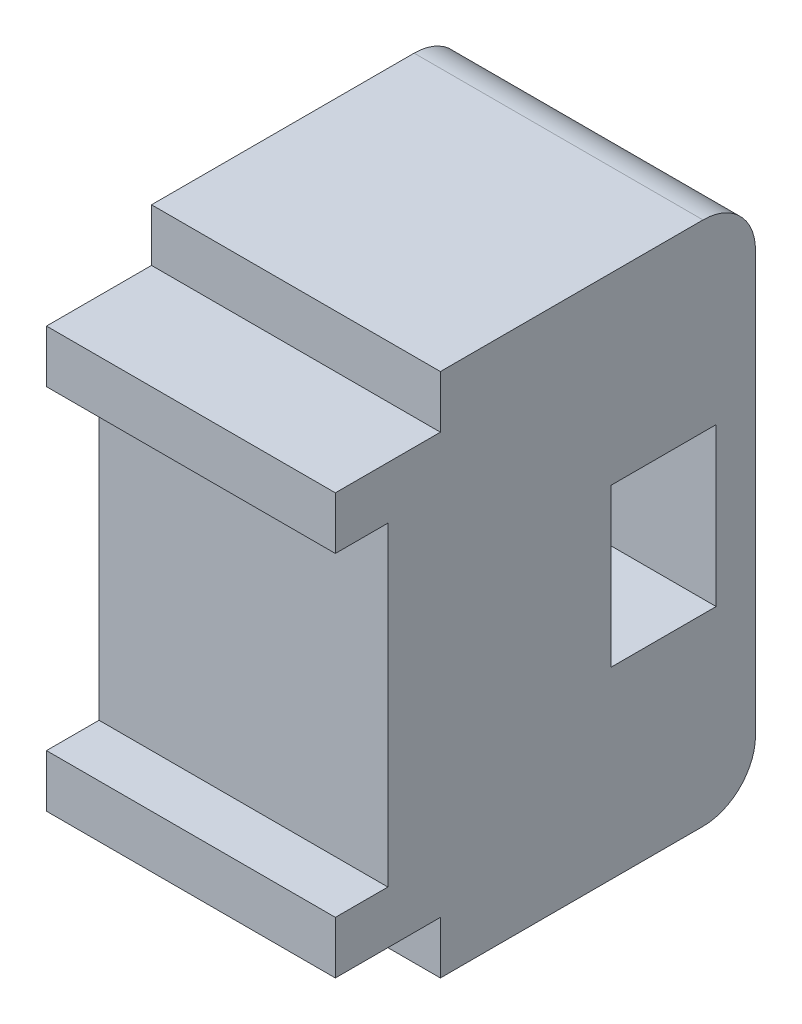
ISO-10303-21;
HEADER;
FILE_DESCRIPTION(('STEP AP214'),'2;1');
FILE_NAME('part.step','',(''),(''),'','','');
FILE_SCHEMA(('AUTOMOTIVE_DESIGN { 1 0 10303 214 1 1 1 1 }'));
ENDSEC;
DATA;
#1=APPLICATION_CONTEXT('core data for automotive mechanical design processes');
#2=APPLICATION_PROTOCOL_DEFINITION('international standard','automotive_design',2000,#1);
#3=PRODUCT_CONTEXT('',#1,'mechanical');
#4=PRODUCT('Part','Part','',(#3));
#5=PRODUCT_RELATED_PRODUCT_CATEGORY('part','',(#4));
#6=PRODUCT_DEFINITION_FORMATION('','',#4);
#7=PRODUCT_DEFINITION_CONTEXT('part definition',#1,'design');
#8=PRODUCT_DEFINITION('design','',#6,#7);
#9=PRODUCT_DEFINITION_SHAPE('','',#8);
#10=(LENGTH_UNIT() NAMED_UNIT(*) SI_UNIT(.MILLI.,.METRE.));
#11=(NAMED_UNIT(*) PLANE_ANGLE_UNIT() SI_UNIT($,.RADIAN.));
#12=(NAMED_UNIT(*) SI_UNIT($,.STERADIAN.) SOLID_ANGLE_UNIT());
#13=UNCERTAINTY_MEASURE_WITH_UNIT(LENGTH_MEASURE(1.E-05),#10,'distance_accuracy_value','');
#14=(GEOMETRIC_REPRESENTATION_CONTEXT(3) GLOBAL_UNCERTAINTY_ASSIGNED_CONTEXT((#13)) GLOBAL_UNIT_ASSIGNED_CONTEXT((#10,
#11,#12)) REPRESENTATION_CONTEXT('',''));
#15=CARTESIAN_POINT('',(0.,0.,0.));
#16=DIRECTION('',(0.,0.,1.));
#17=DIRECTION('',(1.,0.,0.));
#18=AXIS2_PLACEMENT_3D('',#15,#16,#17);
#19=CARTESIAN_POINT('',(11.,0.,0.));
#20=DIRECTION('',(1.,0.,0.));
#21=DIRECTION('',(0.,0.,-1.));
#22=AXIS2_PLACEMENT_3D('',#19,#20,#21);
#23=PLANE('',#22);
#24=DIRECTION('',(0.,1.,0.));
#25=VECTOR('',#24,1.);
#26=CARTESIAN_POINT('',(11.,-10.,-6.));
#27=LINE('',#26,#25);
#28=CARTESIAN_POINT('',(11.,-8.,-6.));
#29=VERTEX_POINT('',#28);
#30=CARTESIAN_POINT('',(11.,8.,-6.));
#31=VERTEX_POINT('',#30);
#32=EDGE_CURVE('E320',#29,#31,#27,.T.);
#33=ORIENTED_EDGE('',*,*,#32,.T.);
#34=CARTESIAN_POINT('',(11.,8.,-4.));
#35=DIRECTION('',(1.,0.,0.));
#36=DIRECTION('',(0.,0.,-1.));
#37=AXIS2_PLACEMENT_3D('',#34,#35,#36);
#38=CIRCLE('',#37,2.);
#39=CARTESIAN_POINT('',(11.,10.,-4.));
#40=VERTEX_POINT('',#39);
#41=EDGE_CURVE('E60',#31,#40,#38,.T.);
#42=ORIENTED_EDGE('',*,*,#41,.T.);
#43=DIRECTION('',(0.,0.,1.));
#44=VECTOR('',#43,1.);
#45=CARTESIAN_POINT('',(11.,10.,6.));
#46=LINE('',#45,#44);
#47=CARTESIAN_POINT('',(11.,10.,6.));
#48=VERTEX_POINT('',#47);
#49=EDGE_CURVE('E307',#40,#48,#46,.T.);
#50=ORIENTED_EDGE('',*,*,#49,.T.);
#51=DIRECTION('',(0.,-1.,0.));
#52=VECTOR('',#51,1.);
#53=CARTESIAN_POINT('',(11.,-10.,6.));
#54=LINE('',#53,#52);
#55=CARTESIAN_POINT('',(11.,8.,6.));
#56=VERTEX_POINT('',#55);
#57=EDGE_CURVE('E312',#48,#56,#54,.T.);
#58=ORIENTED_EDGE('',*,*,#57,.T.);
#59=DIRECTION('',(0.,0.,-1.));
#60=VECTOR('',#59,1.);
#61=CARTESIAN_POINT('',(11.,8.,7.99999999999998));
#62=LINE('',#61,#60);
#63=CARTESIAN_POINT('',(11.,8.,9.99999999999998));
#64=VERTEX_POINT('',#63);
#65=EDGE_CURVE('E290',#64,#56,#62,.T.);
#66=ORIENTED_EDGE('',*,*,#65,.F.);
#67=DIRECTION('',(0.,1.,0.));
#68=VECTOR('',#67,1.);
#69=CARTESIAN_POINT('',(11.,8.,9.99999999999998));
#70=LINE('',#69,#68);
#71=CARTESIAN_POINT('',(11.,6.,9.99999999999998));
#72=VERTEX_POINT('',#71);
#73=EDGE_CURVE('E186',#72,#64,#70,.T.);
#74=ORIENTED_EDGE('',*,*,#73,.F.);
#75=DIRECTION('',(0.,0.,-1.));
#76=VECTOR('',#75,1.);
#77=CARTESIAN_POINT('',(11.,6.,9.99999999999998));
#78=LINE('',#77,#76);
#79=CARTESIAN_POINT('',(11.,6.,7.99999999999998));
#80=VERTEX_POINT('',#79);
#81=EDGE_CURVE('E181',#72,#80,#78,.T.);
#82=ORIENTED_EDGE('',*,*,#81,.T.);
#83=DIRECTION('',(0.,1.,0.));
#84=VECTOR('',#83,1.);
#85=CARTESIAN_POINT('',(11.,-8.,7.99999999999998));
#86=LINE('',#85,#84);
#87=CARTESIAN_POINT('',(11.,-6.,7.99999999999998));
#88=VERTEX_POINT('',#87);
#89=EDGE_CURVE('E278',#88,#80,#86,.T.);
#90=ORIENTED_EDGE('',*,*,#89,.F.);
#91=DIRECTION('',(0.,0.,-1.));
#92=VECTOR('',#91,1.);
#93=CARTESIAN_POINT('',(11.,-6.,9.99999999999998));
#94=LINE('',#93,#92);
#95=CARTESIAN_POINT('',(11.,-6.,9.99999999999998));
#96=VERTEX_POINT('',#95);
#97=EDGE_CURVE('E214',#96,#88,#94,.T.);
#98=ORIENTED_EDGE('',*,*,#97,.F.);
#99=DIRECTION('',(0.,1.,0.));
#100=VECTOR('',#99,1.);
#101=CARTESIAN_POINT('',(11.,-6.,9.99999999999998));
#102=LINE('',#101,#100);
#103=CARTESIAN_POINT('',(11.,-8.,9.99999999999998));
#104=VERTEX_POINT('',#103);
#105=EDGE_CURVE('E224',#104,#96,#102,.T.);
#106=ORIENTED_EDGE('',*,*,#105,.F.);
#107=DIRECTION('',(0.,0.,-1.));
#108=VECTOR('',#107,1.);
#109=CARTESIAN_POINT('',(11.,-8.,7.99999999999998));
#110=LINE('',#109,#108);
#111=CARTESIAN_POINT('',(11.,-8.,6.));
#112=VERTEX_POINT('',#111);
#113=EDGE_CURVE('E294',#104,#112,#110,.T.);
#114=ORIENTED_EDGE('',*,*,#113,.T.);
#115=CARTESIAN_POINT('',(11.,-10.,6.));
#116=VERTEX_POINT('',#115);
#117=EDGE_CURVE('E310',#112,#116,#54,.T.);
#118=ORIENTED_EDGE('',*,*,#117,.T.);
#119=DIRECTION('',(0.,0.,-1.));
#120=VECTOR('',#119,1.);
#121=CARTESIAN_POINT('',(11.,-10.,6.));
#122=LINE('',#121,#120);
#123=CARTESIAN_POINT('',(11.,-10.,-4.));
#124=VERTEX_POINT('',#123);
#125=EDGE_CURVE('E316',#116,#124,#122,.T.);
#126=ORIENTED_EDGE('',*,*,#125,.T.);
#127=CARTESIAN_POINT('',(11.,-8.,-4.));
#128=DIRECTION('',(1.,0.,0.));
#129=DIRECTION('',(0.,0.,-1.));
#130=AXIS2_PLACEMENT_3D('',#127,#128,#129);
#131=CIRCLE('',#130,2.);
#132=EDGE_CURVE('E362',#124,#29,#131,.T.);
#133=ORIENTED_EDGE('',*,*,#132,.T.);
#134=EDGE_LOOP('',(#33,#42,#50,#58,#66,#74,#82,#90,#98,#106,#114,#118,#126,#133));
#135=FACE_BOUND('',#134,.T.);
#136=DIRECTION('',(0.,-1.,0.));
#137=VECTOR('',#136,1.);
#138=CARTESIAN_POINT('',(11.,0.,-4.5));
#139=LINE('',#138,#137);
#140=CARTESIAN_POINT('',(11.,3.,-4.5));
#141=VERTEX_POINT('',#140);
#142=CARTESIAN_POINT('',(11.,-3.,-4.5));
#143=VERTEX_POINT('',#142);
#144=EDGE_CURVE('E270',#141,#143,#139,.T.);
#145=ORIENTED_EDGE('',*,*,#144,.T.);
#146=DIRECTION('',(0.,0.,1.));
#147=VECTOR('',#146,1.);
#148=CARTESIAN_POINT('',(11.,-3.,0.));
#149=LINE('',#148,#147);
#150=CARTESIAN_POINT('',(11.,-3.,-0.499999999999999));
#151=VERTEX_POINT('',#150);
#152=EDGE_CURVE('E274',#143,#151,#149,.T.);
#153=ORIENTED_EDGE('',*,*,#152,.T.);
#154=DIRECTION('',(0.,1.,0.));
#155=VECTOR('',#154,1.);
#156=CARTESIAN_POINT('',(11.,0.,-0.499999999999998));
#157=LINE('',#156,#155);
#158=CARTESIAN_POINT('',(11.,3.,-0.499999999999998));
#159=VERTEX_POINT('',#158);
#160=EDGE_CURVE('E262',#151,#159,#157,.T.);
#161=ORIENTED_EDGE('',*,*,#160,.T.);
#162=DIRECTION('',(0.,0.,-1.));
#163=VECTOR('',#162,1.);
#164=CARTESIAN_POINT('',(11.,3.,0.));
#165=LINE('',#164,#163);
#166=EDGE_CURVE('E266',#159,#141,#165,.T.);
#167=ORIENTED_EDGE('',*,*,#166,.T.);
#168=EDGE_LOOP('',(#145,#153,#161,#167));
#169=FACE_BOUND('',#168,.T.);
#170=ADVANCED_FACE('F51',(#135,#169),#23,.T.);
#171=CARTESIAN_POINT('',(0.,0.,0.));
#172=DIRECTION('',(1.,0.,0.));
#173=DIRECTION('',(0.,0.,-1.));
#174=AXIS2_PLACEMENT_3D('',#171,#172,#173);
#175=PLANE('',#174);
#176=DIRECTION('',(0.,0.,1.));
#177=VECTOR('',#176,1.);
#178=CARTESIAN_POINT('',(0.,10.,6.));
#179=LINE('',#178,#177);
#180=CARTESIAN_POINT('',(0.,10.,-4.));
#181=VERTEX_POINT('',#180);
#182=CARTESIAN_POINT('',(0.,10.,6.));
#183=VERTEX_POINT('',#182);
#184=EDGE_CURVE('E306',#181,#183,#179,.T.);
#185=ORIENTED_EDGE('',*,*,#184,.F.);
#186=CARTESIAN_POINT('',(0.,8.,-4.));
#187=DIRECTION('',(1.,0.,0.));
#188=DIRECTION('',(0.,0.,-1.));
#189=AXIS2_PLACEMENT_3D('',#186,#187,#188);
#190=CIRCLE('',#189,2.);
#191=CARTESIAN_POINT('',(0.,8.,-6.));
#192=VERTEX_POINT('',#191);
#193=EDGE_CURVE('E352',#181,#192,#190,.F.);
#194=ORIENTED_EDGE('',*,*,#193,.T.);
#195=DIRECTION('',(0.,1.,0.));
#196=VECTOR('',#195,1.);
#197=CARTESIAN_POINT('',(0.,-10.,-6.));
#198=LINE('',#197,#196);
#199=CARTESIAN_POINT('',(0.,-8.,-6.));
#200=VERTEX_POINT('',#199);
#201=EDGE_CURVE('E311',#200,#192,#198,.T.);
#202=ORIENTED_EDGE('',*,*,#201,.F.);
#203=CARTESIAN_POINT('',(0.,-8.,-4.));
#204=DIRECTION('',(1.,0.,0.));
#205=DIRECTION('',(0.,0.,-1.));
#206=AXIS2_PLACEMENT_3D('',#203,#204,#205);
#207=CIRCLE('',#206,2.);
#208=CARTESIAN_POINT('',(0.,-10.,-4.));
#209=VERTEX_POINT('',#208);
#210=EDGE_CURVE('E349',#200,#209,#207,.F.);
#211=ORIENTED_EDGE('',*,*,#210,.T.);
#212=DIRECTION('',(0.,0.,-1.));
#213=VECTOR('',#212,1.);
#214=CARTESIAN_POINT('',(0.,-10.,6.));
#215=LINE('',#214,#213);
#216=CARTESIAN_POINT('',(0.,-10.,6.));
#217=VERTEX_POINT('',#216);
#218=EDGE_CURVE('E331',#217,#209,#215,.T.);
#219=ORIENTED_EDGE('',*,*,#218,.F.);
#220=DIRECTION('',(0.,-1.,0.));
#221=VECTOR('',#220,1.);
#222=CARTESIAN_POINT('',(0.,-10.,6.));
#223=LINE('',#222,#221);
#224=CARTESIAN_POINT('',(0.,-8.,6.));
#225=VERTEX_POINT('',#224);
#226=EDGE_CURVE('E327',#225,#217,#223,.T.);
#227=ORIENTED_EDGE('',*,*,#226,.F.);
#228=DIRECTION('',(0.,0.,-1.));
#229=VECTOR('',#228,1.);
#230=CARTESIAN_POINT('',(0.,-8.,7.99999999999998));
#231=LINE('',#230,#229);
#232=CARTESIAN_POINT('',(0.,-8.,9.99999999999998));
#233=VERTEX_POINT('',#232);
#234=EDGE_CURVE('E283',#233,#225,#231,.T.);
#235=ORIENTED_EDGE('',*,*,#234,.F.);
#236=DIRECTION('',(0.,-1.,0.));
#237=VECTOR('',#236,1.);
#238=CARTESIAN_POINT('',(0.,-6.,9.99999999999998));
#239=LINE('',#238,#237);
#240=CARTESIAN_POINT('',(0.,-6.,9.99999999999998));
#241=VERTEX_POINT('',#240);
#242=EDGE_CURVE('E228',#241,#233,#239,.T.);
#243=ORIENTED_EDGE('',*,*,#242,.F.);
#244=DIRECTION('',(0.,0.,-1.));
#245=VECTOR('',#244,1.);
#246=CARTESIAN_POINT('',(0.,-6.,9.99999999999998));
#247=LINE('',#246,#245);
#248=CARTESIAN_POINT('',(0.,-6.,7.99999999999998));
#249=VERTEX_POINT('',#248);
#250=EDGE_CURVE('E218',#241,#249,#247,.T.);
#251=ORIENTED_EDGE('',*,*,#250,.T.);
#252=DIRECTION('',(0.,-1.,0.));
#253=VECTOR('',#252,1.);
#254=CARTESIAN_POINT('',(0.,-8.,7.99999999999998));
#255=LINE('',#254,#253);
#256=CARTESIAN_POINT('',(0.,6.,7.99999999999998));
#257=VERTEX_POINT('',#256);
#258=EDGE_CURVE('E202',#257,#249,#255,.T.);
#259=ORIENTED_EDGE('',*,*,#258,.F.);
#260=DIRECTION('',(0.,0.,-1.));
#261=VECTOR('',#260,1.);
#262=CARTESIAN_POINT('',(0.,6.,9.99999999999998));
#263=LINE('',#262,#261);
#264=CARTESIAN_POINT('',(0.,6.,9.99999999999998));
#265=VERTEX_POINT('',#264);
#266=EDGE_CURVE('E179',#265,#257,#263,.T.);
#267=ORIENTED_EDGE('',*,*,#266,.F.);
#268=DIRECTION('',(0.,-1.,0.));
#269=VECTOR('',#268,1.);
#270=CARTESIAN_POINT('',(0.,8.,9.99999999999998));
#271=LINE('',#270,#269);
#272=CARTESIAN_POINT('',(0.,8.,9.99999999999998));
#273=VERTEX_POINT('',#272);
#274=EDGE_CURVE('E187',#273,#265,#271,.T.);
#275=ORIENTED_EDGE('',*,*,#274,.F.);
#276=DIRECTION('',(0.,0.,-1.));
#277=VECTOR('',#276,1.);
#278=CARTESIAN_POINT('',(0.,8.,7.99999999999998));
#279=LINE('',#278,#277);
#280=CARTESIAN_POINT('',(0.,8.,6.));
#281=VERTEX_POINT('',#280);
#282=EDGE_CURVE('E287',#273,#281,#279,.T.);
#283=ORIENTED_EDGE('',*,*,#282,.T.);
#284=EDGE_CURVE('E328',#183,#281,#223,.T.);
#285=ORIENTED_EDGE('',*,*,#284,.F.);
#286=EDGE_LOOP('',(#185,#194,#202,#211,#219,#227,#235,#243,#251,#259,#267,#275,#283,#285));
#287=FACE_BOUND('',#286,.T.);
#288=DIRECTION('',(0.,0.,-1.));
#289=VECTOR('',#288,1.);
#290=CARTESIAN_POINT('',(0.,-3.,-0.499999999999999));
#291=LINE('',#290,#289);
#292=CARTESIAN_POINT('',(0.,-3.,-0.499999999999999));
#293=VERTEX_POINT('',#292);
#294=CARTESIAN_POINT('',(0.,-3.,-4.5));
#295=VERTEX_POINT('',#294);
#296=EDGE_CURVE('E204',#293,#295,#291,.T.);
#297=ORIENTED_EDGE('',*,*,#296,.T.);
#298=DIRECTION('',(0.,1.,0.));
#299=VECTOR('',#298,1.);
#300=CARTESIAN_POINT('',(0.,-3.,-4.5));
#301=LINE('',#300,#299);
#302=CARTESIAN_POINT('',(0.,3.,-4.5));
#303=VERTEX_POINT('',#302);
#304=EDGE_CURVE('E209',#295,#303,#301,.T.);
#305=ORIENTED_EDGE('',*,*,#304,.T.);
#306=DIRECTION('',(0.,0.,1.));
#307=VECTOR('',#306,1.);
#308=CARTESIAN_POINT('',(0.,3.,-0.499999999999998));
#309=LINE('',#308,#307);
#310=CARTESIAN_POINT('',(0.,3.,-0.499999999999998));
#311=VERTEX_POINT('',#310);
#312=EDGE_CURVE('E241',#303,#311,#309,.T.);
#313=ORIENTED_EDGE('',*,*,#312,.T.);
#314=DIRECTION('',(0.,-1.,0.));
#315=VECTOR('',#314,1.);
#316=CARTESIAN_POINT('',(0.,-3.,-0.499999999999999));
#317=LINE('',#316,#315);
#318=EDGE_CURVE('E245',#311,#293,#317,.T.);
#319=ORIENTED_EDGE('',*,*,#318,.T.);
#320=EDGE_LOOP('',(#297,#305,#313,#319));
#321=FACE_BOUND('',#320,.T.);
#322=ADVANCED_FACE('F199',(#287,#321),#175,.F.);
#323=CARTESIAN_POINT('',(11.,-10.,6.));
#324=DIRECTION('',(0.,0.,-1.));
#325=DIRECTION('',(-1.,0.,0.));
#326=AXIS2_PLACEMENT_3D('',#323,#324,#325);
#327=PLANE('',#326);
#328=DIRECTION('',(1.,0.,0.));
#329=VECTOR('',#328,1.);
#330=CARTESIAN_POINT('',(11.,-8.,6.));
#331=LINE('',#330,#329);
#332=EDGE_CURVE('E302',#225,#112,#331,.T.);
#333=ORIENTED_EDGE('',*,*,#332,.F.);
#334=ORIENTED_EDGE('',*,*,#226,.T.);
#335=DIRECTION('',(-1.,0.,0.));
#336=VECTOR('',#335,1.);
#337=CARTESIAN_POINT('',(11.,-10.,6.));
#338=LINE('',#337,#336);
#339=EDGE_CURVE('E324',#116,#217,#338,.T.);
#340=ORIENTED_EDGE('',*,*,#339,.F.);
#341=ORIENTED_EDGE('',*,*,#117,.F.);
#342=EDGE_LOOP('',(#333,#334,#340,#341));
#343=FACE_BOUND('',#342,.T.);
#344=ADVANCED_FACE('F393',(#343),#327,.F.);
#345=DIRECTION('',(-1.,0.,0.));
#346=VECTOR('',#345,1.);
#347=CARTESIAN_POINT('',(11.,8.,6.));
#348=LINE('',#347,#346);
#349=EDGE_CURVE('E298',#56,#281,#348,.T.);
#350=ORIENTED_EDGE('',*,*,#349,.F.);
#351=ORIENTED_EDGE('',*,*,#57,.F.);
#352=DIRECTION('',(-1.,0.,0.));
#353=VECTOR('',#352,1.);
#354=CARTESIAN_POINT('',(11.,10.,6.));
#355=LINE('',#354,#353);
#356=EDGE_CURVE('E341',#48,#183,#355,.T.);
#357=ORIENTED_EDGE('',*,*,#356,.T.);
#358=ORIENTED_EDGE('',*,*,#284,.T.);
#359=EDGE_LOOP('',(#350,#351,#357,#358));
#360=FACE_BOUND('',#359,.T.);
#361=ADVANCED_FACE('F416',(#360),#327,.F.);
#362=CARTESIAN_POINT('',(11.,10.,6.));
#363=DIRECTION('',(0.,-1.,0.));
#364=DIRECTION('',(0.,0.,-1.));
#365=AXIS2_PLACEMENT_3D('',#362,#363,#364);
#366=PLANE('',#365);
#367=ORIENTED_EDGE('',*,*,#49,.F.);
#368=DIRECTION('',(-1.,0.,0.));
#369=VECTOR('',#368,1.);
#370=CARTESIAN_POINT('',(11.,10.,-4.));
#371=LINE('',#370,#369);
#372=EDGE_CURVE('E345',#40,#181,#371,.T.);
#373=ORIENTED_EDGE('',*,*,#372,.T.);
#374=ORIENTED_EDGE('',*,*,#184,.T.);
#375=ORIENTED_EDGE('',*,*,#356,.F.);
#376=EDGE_LOOP('',(#367,#373,#374,#375));
#377=FACE_BOUND('',#376,.T.);
#378=ADVANCED_FACE('F376',(#377),#366,.F.);
#379=CARTESIAN_POINT('',(11.,-10.,6.));
#380=DIRECTION('',(0.,1.,0.));
#381=DIRECTION('',(0.,0.,1.));
#382=AXIS2_PLACEMENT_3D('',#379,#380,#381);
#383=PLANE('',#382);
#384=ORIENTED_EDGE('',*,*,#218,.T.);
#385=DIRECTION('',(-1.,0.,0.));
#386=VECTOR('',#385,1.);
#387=CARTESIAN_POINT('',(11.,-10.,-4.));
#388=LINE('',#387,#386);
#389=EDGE_CURVE('E11',#209,#124,#388,.F.);
#390=ORIENTED_EDGE('',*,*,#389,.T.);
#391=ORIENTED_EDGE('',*,*,#125,.F.);
#392=ORIENTED_EDGE('',*,*,#339,.T.);
#393=EDGE_LOOP('',(#384,#390,#391,#392));
#394=FACE_BOUND('',#393,.T.);
#395=ADVANCED_FACE('F388',(#394),#383,.F.);
#396=CARTESIAN_POINT('',(11.,-10.,-6.));
#397=DIRECTION('',(0.,0.,1.));
#398=DIRECTION('',(1.,0.,0.));
#399=AXIS2_PLACEMENT_3D('',#396,#397,#398);
#400=PLANE('',#399);
#401=ORIENTED_EDGE('',*,*,#201,.T.);
#402=DIRECTION('',(-1.,0.,0.));
#403=VECTOR('',#402,1.);
#404=CARTESIAN_POINT('',(11.,8.,-6.));
#405=LINE('',#404,#403);
#406=EDGE_CURVE('E359',#192,#31,#405,.F.);
#407=ORIENTED_EDGE('',*,*,#406,.T.);
#408=ORIENTED_EDGE('',*,*,#32,.F.);
#409=DIRECTION('',(-1.,0.,0.));
#410=VECTOR('',#409,1.);
#411=CARTESIAN_POINT('',(11.,-8.,-6.));
#412=LINE('',#411,#410);
#413=EDGE_CURVE('E355',#29,#200,#412,.T.);
#414=ORIENTED_EDGE('',*,*,#413,.T.);
#415=EDGE_LOOP('',(#401,#407,#408,#414));
#416=FACE_BOUND('',#415,.T.);
#417=ADVANCED_FACE('F381',(#416),#400,.F.);
#418=CARTESIAN_POINT('',(0.,-8.,7.99999999999998));
#419=DIRECTION('',(0.,1.,0.));
#420=DIRECTION('',(0.,0.,1.));
#421=AXIS2_PLACEMENT_3D('',#418,#419,#420);
#422=PLANE('',#421);
#423=ORIENTED_EDGE('',*,*,#234,.T.);
#424=ORIENTED_EDGE('',*,*,#332,.T.);
#425=ORIENTED_EDGE('',*,*,#113,.F.);
#426=DIRECTION('',(1.,0.,0.));
#427=VECTOR('',#426,1.);
#428=CARTESIAN_POINT('',(0.,-8.,9.99999999999998));
#429=LINE('',#428,#427);
#430=EDGE_CURVE('E221',#233,#104,#429,.T.);
#431=ORIENTED_EDGE('',*,*,#430,.F.);
#432=EDGE_LOOP('',(#423,#424,#425,#431));
#433=FACE_BOUND('',#432,.T.);
#434=ADVANCED_FACE('F400',(#433),#422,.F.);
#435=CARTESIAN_POINT('',(0.,8.,7.99999999999998));
#436=DIRECTION('',(0.,-1.,0.));
#437=DIRECTION('',(1.,0.,0.));
#438=AXIS2_PLACEMENT_3D('',#435,#436,#437);
#439=PLANE('',#438);
#440=ORIENTED_EDGE('',*,*,#65,.T.);
#441=ORIENTED_EDGE('',*,*,#349,.T.);
#442=ORIENTED_EDGE('',*,*,#282,.F.);
#443=DIRECTION('',(-1.,0.,0.));
#444=VECTOR('',#443,1.);
#445=CARTESIAN_POINT('',(0.,8.,9.99999999999998));
#446=LINE('',#445,#444);
#447=EDGE_CURVE('E193',#64,#273,#446,.T.);
#448=ORIENTED_EDGE('',*,*,#447,.F.);
#449=EDGE_LOOP('',(#440,#441,#442,#448));
#450=FACE_BOUND('',#449,.T.);
#451=ADVANCED_FACE('F414',(#450),#439,.F.);
#452=CARTESIAN_POINT('',(0.,0.,7.99999999999998));
#453=DIRECTION('',(0.,0.,1.));
#454=DIRECTION('',(1.,0.,0.));
#455=AXIS2_PLACEMENT_3D('',#452,#453,#454);
#456=PLANE('',#455);
#457=DIRECTION('',(1.,0.,0.));
#458=VECTOR('',#457,1.);
#459=CARTESIAN_POINT('',(0.,6.,7.99999999999998));
#460=LINE('',#459,#458);
#461=EDGE_CURVE('E67',#257,#80,#460,.T.);
#462=ORIENTED_EDGE('',*,*,#461,.F.);
#463=ORIENTED_EDGE('',*,*,#258,.T.);
#464=DIRECTION('',(-1.,0.,0.));
#465=VECTOR('',#464,1.);
#466=CARTESIAN_POINT('',(0.,-6.,7.99999999999998));
#467=LINE('',#466,#465);
#468=EDGE_CURVE('E72',#88,#249,#467,.T.);
#469=ORIENTED_EDGE('',*,*,#468,.F.);
#470=ORIENTED_EDGE('',*,*,#89,.T.);
#471=EDGE_LOOP('',(#462,#463,#469,#470));
#472=FACE_BOUND('',#471,.T.);
#473=ADVANCED_FACE('F407',(#472),#456,.T.);
#474=CARTESIAN_POINT('',(11.,8.,-4.));
#475=DIRECTION('',(-1.,0.,0.));
#476=DIRECTION('',(0.,0.,1.));
#477=AXIS2_PLACEMENT_3D('',#474,#475,#476);
#478=CYLINDRICAL_SURFACE('',#477,2.);
#479=ORIENTED_EDGE('',*,*,#41,.F.);
#480=ORIENTED_EDGE('',*,*,#406,.F.);
#481=ORIENTED_EDGE('',*,*,#193,.F.);
#482=ORIENTED_EDGE('',*,*,#372,.F.);
#483=EDGE_LOOP('',(#479,#480,#481,#482));
#484=FACE_BOUND('',#483,.T.);
#485=ADVANCED_FACE('F377',(#484),#478,.T.);
#486=CARTESIAN_POINT('',(11.,-8.,-4.));
#487=DIRECTION('',(-1.,0.,0.));
#488=DIRECTION('',(0.,0.,1.));
#489=AXIS2_PLACEMENT_3D('',#486,#487,#488);
#490=CYLINDRICAL_SURFACE('',#489,2.);
#491=ORIENTED_EDGE('',*,*,#132,.F.);
#492=ORIENTED_EDGE('',*,*,#389,.F.);
#493=ORIENTED_EDGE('',*,*,#210,.F.);
#494=ORIENTED_EDGE('',*,*,#413,.F.);
#495=EDGE_LOOP('',(#491,#492,#493,#494));
#496=FACE_BOUND('',#495,.T.);
#497=ADVANCED_FACE('F53',(#496),#490,.T.);
#498=CARTESIAN_POINT('',(15.,-3.,-0.499999999999999));
#499=DIRECTION('',(0.,1.,0.));
#500=DIRECTION('',(0.,0.,1.));
#501=AXIS2_PLACEMENT_3D('',#498,#499,#500);
#502=PLANE('',#501);
#503=DIRECTION('',(-1.,0.,0.));
#504=VECTOR('',#503,1.);
#505=CARTESIAN_POINT('',(15.,-3.,-4.5));
#506=LINE('',#505,#504);
#507=EDGE_CURVE('E259',#143,#295,#506,.T.);
#508=ORIENTED_EDGE('',*,*,#507,.T.);
#509=ORIENTED_EDGE('',*,*,#296,.F.);
#510=DIRECTION('',(-1.,0.,0.));
#511=VECTOR('',#510,1.);
#512=CARTESIAN_POINT('',(15.,-3.,-0.499999999999999));
#513=LINE('',#512,#511);
#514=EDGE_CURVE('E249',#151,#293,#513,.T.);
#515=ORIENTED_EDGE('',*,*,#514,.F.);
#516=ORIENTED_EDGE('',*,*,#152,.F.);
#517=EDGE_LOOP('',(#508,#509,#515,#516));
#518=FACE_BOUND('',#517,.T.);
#519=ADVANCED_FACE('F465',(#518),#502,.T.);
#520=CARTESIAN_POINT('',(15.,-3.,-4.5));
#521=DIRECTION('',(0.,0.,1.));
#522=DIRECTION('',(0.,-1.,0.));
#523=AXIS2_PLACEMENT_3D('',#520,#521,#522);
#524=PLANE('',#523);
#525=DIRECTION('',(-1.,0.,0.));
#526=VECTOR('',#525,1.);
#527=CARTESIAN_POINT('',(15.,3.,-4.5));
#528=LINE('',#527,#526);
#529=EDGE_CURVE('E256',#141,#303,#528,.T.);
#530=ORIENTED_EDGE('',*,*,#529,.T.);
#531=ORIENTED_EDGE('',*,*,#304,.F.);
#532=ORIENTED_EDGE('',*,*,#507,.F.);
#533=ORIENTED_EDGE('',*,*,#144,.F.);
#534=EDGE_LOOP('',(#530,#531,#532,#533));
#535=FACE_BOUND('',#534,.T.);
#536=ADVANCED_FACE('F473',(#535),#524,.T.);
#537=CARTESIAN_POINT('',(15.,3.,-0.499999999999998));
#538=DIRECTION('',(0.,-1.,0.));
#539=DIRECTION('',(0.,0.,-1.));
#540=AXIS2_PLACEMENT_3D('',#537,#538,#539);
#541=PLANE('',#540);
#542=DIRECTION('',(-1.,0.,0.));
#543=VECTOR('',#542,1.);
#544=CARTESIAN_POINT('',(15.,3.,-0.499999999999998));
#545=LINE('',#544,#543);
#546=EDGE_CURVE('E253',#159,#311,#545,.T.);
#547=ORIENTED_EDGE('',*,*,#546,.T.);
#548=ORIENTED_EDGE('',*,*,#312,.F.);
#549=ORIENTED_EDGE('',*,*,#529,.F.);
#550=ORIENTED_EDGE('',*,*,#166,.F.);
#551=EDGE_LOOP('',(#547,#548,#549,#550));
#552=FACE_BOUND('',#551,.T.);
#553=ADVANCED_FACE('F483',(#552),#541,.T.);
#554=CARTESIAN_POINT('',(15.,-3.,-0.499999999999999));
#555=DIRECTION('',(0.,0.,-1.));
#556=DIRECTION('',(0.,1.,0.));
#557=AXIS2_PLACEMENT_3D('',#554,#555,#556);
#558=PLANE('',#557);
#559=ORIENTED_EDGE('',*,*,#514,.T.);
#560=ORIENTED_EDGE('',*,*,#318,.F.);
#561=ORIENTED_EDGE('',*,*,#546,.F.);
#562=ORIENTED_EDGE('',*,*,#160,.F.);
#563=EDGE_LOOP('',(#559,#560,#561,#562));
#564=FACE_BOUND('',#563,.T.);
#565=ADVANCED_FACE('F491',(#564),#558,.T.);
#566=CARTESIAN_POINT('',(0.,-6.,9.99999999999998));
#567=DIRECTION('',(0.,-1.,0.));
#568=DIRECTION('',(0.,0.,-1.));
#569=AXIS2_PLACEMENT_3D('',#566,#567,#568);
#570=PLANE('',#569);
#571=ORIENTED_EDGE('',*,*,#468,.T.);
#572=ORIENTED_EDGE('',*,*,#250,.F.);
#573=DIRECTION('',(-1.,0.,0.));
#574=VECTOR('',#573,1.);
#575=CARTESIAN_POINT('',(0.,-6.,9.99999999999998));
#576=LINE('',#575,#574);
#577=EDGE_CURVE('E232',#96,#241,#576,.T.);
#578=ORIENTED_EDGE('',*,*,#577,.F.);
#579=ORIENTED_EDGE('',*,*,#97,.T.);
#580=EDGE_LOOP('',(#571,#572,#578,#579));
#581=FACE_BOUND('',#580,.T.);
#582=ADVANCED_FACE('F406',(#581),#570,.F.);
#583=CARTESIAN_POINT('',(0.,0.,9.99999999999998));
#584=DIRECTION('',(0.,0.,1.));
#585=DIRECTION('',(1.,0.,0.));
#586=AXIS2_PLACEMENT_3D('',#583,#584,#585);
#587=PLANE('',#586);
#588=ORIENTED_EDGE('',*,*,#105,.T.);
#589=ORIENTED_EDGE('',*,*,#577,.T.);
#590=ORIENTED_EDGE('',*,*,#242,.T.);
#591=ORIENTED_EDGE('',*,*,#430,.T.);
#592=EDGE_LOOP('',(#588,#589,#590,#591));
#593=FACE_BOUND('',#592,.T.);
#594=ADVANCED_FACE('F402',(#593),#587,.T.);
#595=CARTESIAN_POINT('',(0.,6.,9.99999999999998));
#596=DIRECTION('',(0.,1.,0.));
#597=DIRECTION('',(0.,0.,1.));
#598=AXIS2_PLACEMENT_3D('',#595,#596,#597);
#599=PLANE('',#598);
#600=ORIENTED_EDGE('',*,*,#461,.T.);
#601=ORIENTED_EDGE('',*,*,#81,.F.);
#602=DIRECTION('',(1.,0.,0.));
#603=VECTOR('',#602,1.);
#604=CARTESIAN_POINT('',(0.,6.,9.99999999999998));
#605=LINE('',#604,#603);
#606=EDGE_CURVE('E175',#265,#72,#605,.T.);
#607=ORIENTED_EDGE('',*,*,#606,.F.);
#608=ORIENTED_EDGE('',*,*,#266,.T.);
#609=EDGE_LOOP('',(#600,#601,#607,#608));
#610=FACE_BOUND('',#609,.T.);
#611=ADVANCED_FACE('F177',(#610),#599,.F.);
#612=CARTESIAN_POINT('',(0.,0.,9.99999999999998));
#613=DIRECTION('',(0.,0.,1.));
#614=DIRECTION('',(1.,0.,0.));
#615=AXIS2_PLACEMENT_3D('',#612,#613,#614);
#616=PLANE('',#615);
#617=ORIENTED_EDGE('',*,*,#274,.T.);
#618=ORIENTED_EDGE('',*,*,#606,.T.);
#619=ORIENTED_EDGE('',*,*,#73,.T.);
#620=ORIENTED_EDGE('',*,*,#447,.T.);
#621=EDGE_LOOP('',(#617,#618,#619,#620));
#622=FACE_BOUND('',#621,.T.);
#623=ADVANCED_FACE('F191',(#622),#616,.T.);
#624=CLOSED_SHELL('',(#170,#322,#344,#361,#378,#395,#417,#434,#451,#473,#485,#497,#519,#536,
#553,#565,#582,#594,#611,#623));
#625=MANIFOLD_SOLID_BREP('B2',#624);
#626=ADVANCED_BREP_SHAPE_REPRESENTATION('',(#18,#625),#14);
#627=SHAPE_DEFINITION_REPRESENTATION(#9,#626);
ENDSEC;
END-ISO-10303-21;
